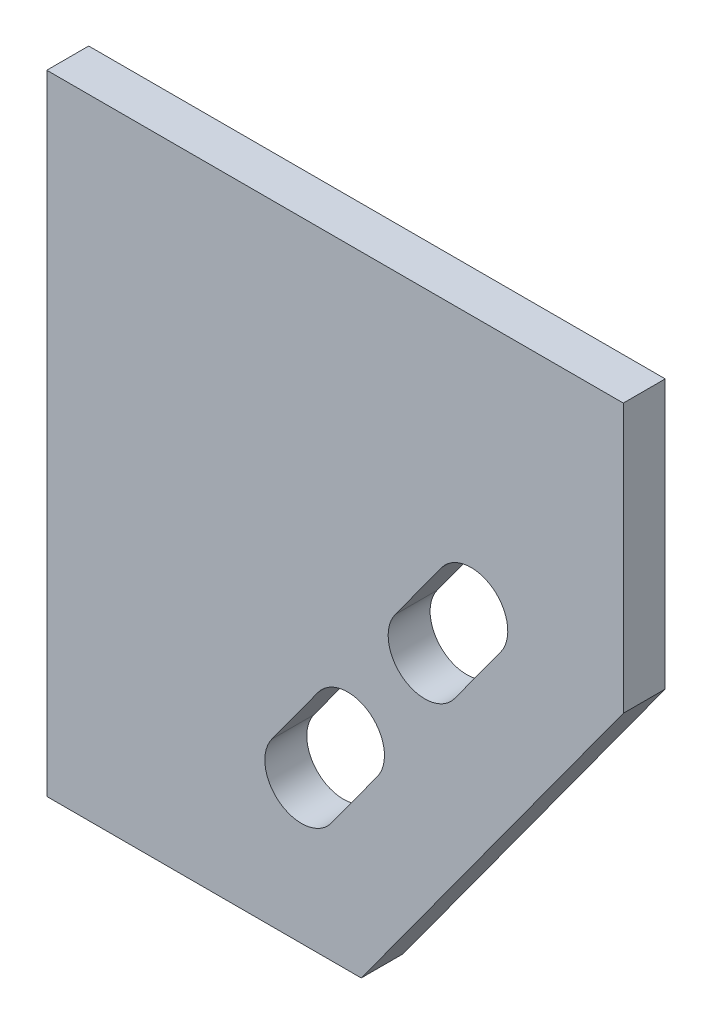
ISO-10303-21;
HEADER;
FILE_DESCRIPTION(('STEP AP214'),'2;1');
FILE_NAME('part.step','',(''),(''),'','','');
FILE_SCHEMA(('AUTOMOTIVE_DESIGN { 1 0 10303 214 1 1 1 1 }'));
ENDSEC;
DATA;
#1=APPLICATION_CONTEXT('core data for automotive mechanical design processes');
#2=APPLICATION_PROTOCOL_DEFINITION('international standard','automotive_design',2000,#1);
#3=PRODUCT_CONTEXT('',#1,'mechanical');
#4=PRODUCT('Part','Part','',(#3));
#5=PRODUCT_RELATED_PRODUCT_CATEGORY('part','',(#4));
#6=PRODUCT_DEFINITION_FORMATION('','',#4);
#7=PRODUCT_DEFINITION_CONTEXT('part definition',#1,'design');
#8=PRODUCT_DEFINITION('design','',#6,#7);
#9=PRODUCT_DEFINITION_SHAPE('','',#8);
#10=(LENGTH_UNIT() NAMED_UNIT(*) SI_UNIT(.MILLI.,.METRE.));
#11=(NAMED_UNIT(*) PLANE_ANGLE_UNIT() SI_UNIT($,.RADIAN.));
#12=(NAMED_UNIT(*) SI_UNIT($,.STERADIAN.) SOLID_ANGLE_UNIT());
#13=UNCERTAINTY_MEASURE_WITH_UNIT(LENGTH_MEASURE(1.E-05),#10,'distance_accuracy_value','');
#14=(GEOMETRIC_REPRESENTATION_CONTEXT(3) GLOBAL_UNCERTAINTY_ASSIGNED_CONTEXT((#13)) GLOBAL_UNIT_ASSIGNED_CONTEXT((#10,
#11,#12)) REPRESENTATION_CONTEXT('',''));
#15=CARTESIAN_POINT('',(0.,0.,0.));
#16=DIRECTION('',(0.,0.,1.));
#17=DIRECTION('',(1.,0.,0.));
#18=AXIS2_PLACEMENT_3D('',#15,#16,#17);
#19=CARTESIAN_POINT('',(59.9999999999996,0.,-8.00000000000001));
#20=DIRECTION('',(0.,-1.,0.));
#21=DIRECTION('',(1.,0.,0.));
#22=AXIS2_PLACEMENT_3D('',#19,#20,#21);
#23=PLANE('',#22);
#24=DIRECTION('',(1.,0.,0.));
#25=VECTOR('',#24,1.);
#26=CARTESIAN_POINT('',(59.9999999999996,0.,0.));
#27=LINE('',#26,#25);
#28=CARTESIAN_POINT('',(0.,0.,0.));
#29=VERTEX_POINT('',#28);
#30=CARTESIAN_POINT('',(59.9999999999996,0.,0.));
#31=VERTEX_POINT('',#30);
#32=EDGE_CURVE('E197',#29,#31,#27,.T.);
#33=ORIENTED_EDGE('',*,*,#32,.F.);
#34=DIRECTION('',(0.,0.,1.));
#35=VECTOR('',#34,1.);
#36=CARTESIAN_POINT('',(0.,0.,-8.00000000000001));
#37=LINE('',#36,#35);
#38=CARTESIAN_POINT('',(0.,0.,-8.00000000000001));
#39=VERTEX_POINT('',#38);
#40=EDGE_CURVE('E11',#39,#29,#37,.T.);
#41=ORIENTED_EDGE('',*,*,#40,.F.);
#42=DIRECTION('',(1.,0.,0.));
#43=VECTOR('',#42,1.);
#44=CARTESIAN_POINT('',(59.9999999999996,0.,-8.00000000000001));
#45=LINE('',#44,#43);
#46=CARTESIAN_POINT('',(59.9999999999996,0.,-8.00000000000001));
#47=VERTEX_POINT('',#46);
#48=EDGE_CURVE('E198',#39,#47,#45,.T.);
#49=ORIENTED_EDGE('',*,*,#48,.T.);
#50=DIRECTION('',(0.,0.,1.));
#51=VECTOR('',#50,1.);
#52=CARTESIAN_POINT('',(59.9999999999996,0.,-8.00000000000001));
#53=LINE('',#52,#51);
#54=EDGE_CURVE('E41',#47,#31,#53,.T.);
#55=ORIENTED_EDGE('',*,*,#54,.T.);
#56=EDGE_LOOP('',(#33,#41,#49,#55));
#57=FACE_BOUND('',#56,.T.);
#58=ADVANCED_FACE('F38',(#57),#23,.T.);
#59=CARTESIAN_POINT('',(0.,0.,-8.00000000000001));
#60=DIRECTION('',(-1.,0.,0.));
#61=DIRECTION('',(0.,0.,1.));
#62=AXIS2_PLACEMENT_3D('',#59,#60,#61);
#63=PLANE('',#62);
#64=DIRECTION('',(0.,-1.,0.));
#65=VECTOR('',#64,1.);
#66=CARTESIAN_POINT('',(0.,0.,0.));
#67=LINE('',#66,#65);
#68=CARTESIAN_POINT('',(0.,120.,-4.44089209850063E-13));
#69=VERTEX_POINT('',#68);
#70=EDGE_CURVE('E202',#69,#29,#67,.T.);
#71=ORIENTED_EDGE('',*,*,#70,.F.);
#72=DIRECTION('',(0.,0.,1.));
#73=VECTOR('',#72,1.);
#74=CARTESIAN_POINT('',(0.,120.,-8.00000000000045));
#75=LINE('',#74,#73);
#76=CARTESIAN_POINT('',(0.,120.,-8.00000000000045));
#77=VERTEX_POINT('',#76);
#78=EDGE_CURVE('E46',#77,#69,#75,.T.);
#79=ORIENTED_EDGE('',*,*,#78,.F.);
#80=DIRECTION('',(0.,-1.,0.));
#81=VECTOR('',#80,1.);
#82=CARTESIAN_POINT('',(0.,0.,-8.00000000000001));
#83=LINE('',#82,#81);
#84=EDGE_CURVE('E211',#77,#39,#83,.T.);
#85=ORIENTED_EDGE('',*,*,#84,.T.);
#86=ORIENTED_EDGE('',*,*,#40,.T.);
#87=EDGE_LOOP('',(#71,#79,#85,#86));
#88=FACE_BOUND('',#87,.T.);
#89=ADVANCED_FACE('F242',(#88),#63,.T.);
#90=CARTESIAN_POINT('',(0.,120.,-8.00000000000045));
#91=DIRECTION('',(0.,1.,0.));
#92=DIRECTION('',(0.,0.,1.));
#93=AXIS2_PLACEMENT_3D('',#90,#91,#92);
#94=PLANE('',#93);
#95=DIRECTION('',(-1.,0.,0.));
#96=VECTOR('',#95,1.);
#97=CARTESIAN_POINT('',(0.,120.,-4.44089209850063E-13));
#98=LINE('',#97,#96);
#99=CARTESIAN_POINT('',(110.,120.,-4.44089209850063E-13));
#100=VERTEX_POINT('',#99);
#101=EDGE_CURVE('E222',#100,#69,#98,.T.);
#102=ORIENTED_EDGE('',*,*,#101,.F.);
#103=DIRECTION('',(0.,0.,1.));
#104=VECTOR('',#103,1.);
#105=CARTESIAN_POINT('',(110.,120.,-8.00000000000045));
#106=LINE('',#105,#104);
#107=CARTESIAN_POINT('',(110.,120.,-8.00000000000045));
#108=VERTEX_POINT('',#107);
#109=EDGE_CURVE('E228',#108,#100,#106,.T.);
#110=ORIENTED_EDGE('',*,*,#109,.F.);
#111=DIRECTION('',(-1.,0.,0.));
#112=VECTOR('',#111,1.);
#113=CARTESIAN_POINT('',(0.,120.,-8.00000000000045));
#114=LINE('',#113,#112);
#115=EDGE_CURVE('E208',#108,#77,#114,.T.);
#116=ORIENTED_EDGE('',*,*,#115,.T.);
#117=ORIENTED_EDGE('',*,*,#78,.T.);
#118=EDGE_LOOP('',(#102,#110,#116,#117));
#119=FACE_BOUND('',#118,.T.);
#120=ADVANCED_FACE('F251',(#119),#94,.T.);
#121=CARTESIAN_POINT('',(110.,120.,-8.00000000000045));
#122=DIRECTION('',(1.,0.,0.));
#123=DIRECTION('',(0.,1.,0.));
#124=AXIS2_PLACEMENT_3D('',#121,#122,#123);
#125=PLANE('',#124);
#126=DIRECTION('',(0.,1.,0.));
#127=VECTOR('',#126,1.);
#128=CARTESIAN_POINT('',(110.,120.,-4.44089209850063E-13));
#129=LINE('',#128,#127);
#130=CARTESIAN_POINT('',(110.,68.7386354243378,-4.44089209850063E-13));
#131=VERTEX_POINT('',#130);
#132=EDGE_CURVE('E219',#131,#100,#129,.T.);
#133=ORIENTED_EDGE('',*,*,#132,.F.);
#134=DIRECTION('',(0.,0.,1.));
#135=VECTOR('',#134,1.);
#136=CARTESIAN_POINT('',(110.,68.7386354243378,-8.00000000000045));
#137=LINE('',#136,#135);
#138=CARTESIAN_POINT('',(110.,68.7386354243378,-8.00000000000045));
#139=VERTEX_POINT('',#138);
#140=EDGE_CURVE('E229',#139,#131,#137,.T.);
#141=ORIENTED_EDGE('',*,*,#140,.F.);
#142=DIRECTION('',(0.,1.,0.));
#143=VECTOR('',#142,1.);
#144=CARTESIAN_POINT('',(110.,120.,-8.00000000000045));
#145=LINE('',#144,#143);
#146=EDGE_CURVE('E205',#139,#108,#145,.T.);
#147=ORIENTED_EDGE('',*,*,#146,.T.);
#148=ORIENTED_EDGE('',*,*,#109,.T.);
#149=EDGE_LOOP('',(#133,#141,#147,#148));
#150=FACE_BOUND('',#149,.T.);
#151=ADVANCED_FACE('F249',(#150),#125,.T.);
#152=CARTESIAN_POINT('',(110.,68.7386354243378,-8.00000000000045));
#153=DIRECTION('',(0.808689828521619,-0.588235294117647,0.));
#154=DIRECTION('',(0.588235294117647,0.808689828521619,0.));
#155=AXIS2_PLACEMENT_3D('',#152,#153,#154);
#156=PLANE('',#155);
#157=DIRECTION('',(0.588235294117647,0.808689828521619,0.));
#158=VECTOR('',#157,1.);
#159=CARTESIAN_POINT('',(110.,68.7386354243378,-4.44089209850063E-13));
#160=LINE('',#159,#158);
#161=EDGE_CURVE('E216',#31,#131,#160,.T.);
#162=ORIENTED_EDGE('',*,*,#161,.F.);
#163=ORIENTED_EDGE('',*,*,#54,.F.);
#164=DIRECTION('',(0.588235294117647,0.808689828521619,0.));
#165=VECTOR('',#164,1.);
#166=CARTESIAN_POINT('',(110.,68.7386354243378,-8.00000000000045));
#167=LINE('',#166,#165);
#168=EDGE_CURVE('E201',#47,#139,#167,.T.);
#169=ORIENTED_EDGE('',*,*,#168,.T.);
#170=ORIENTED_EDGE('',*,*,#140,.T.);
#171=EDGE_LOOP('',(#162,#163,#169,#170));
#172=FACE_BOUND('',#171,.T.);
#173=ADVANCED_FACE('F237',(#172),#156,.T.);
#174=CARTESIAN_POINT('',(0.,0.,-8.00000000000001));
#175=DIRECTION('',(0.,0.,-1.));
#176=DIRECTION('',(-1.,0.,0.));
#177=AXIS2_PLACEMENT_3D('',#174,#175,#176);
#178=PLANE('',#177);
#179=CARTESIAN_POINT('',(72.1356954634302,59.1838229216304,-8.00000000000045));
#180=DIRECTION('',(0.,0.,-1.));
#181=DIRECTION('',(-1.,0.,0.));
#182=AXIS2_PLACEMENT_3D('',#179,#180,#181);
#183=CIRCLE('',#182,6.99999999999999);
#184=CARTESIAN_POINT('',(77.7965242630812,55.0661758628066,-8.00000000000045));
#185=VERTEX_POINT('',#184);
#186=CARTESIAN_POINT('',(66.4748666637784,63.3014699804537,-8.00000000000045));
#187=VERTEX_POINT('',#186);
#188=EDGE_CURVE('E195',#185,#187,#183,.T.);
#189=ORIENTED_EDGE('',*,*,#188,.F.);
#190=DIRECTION('',(-0.588235294117648,-0.808689828521619,0.));
#191=VECTOR('',#190,1.);
#192=CARTESIAN_POINT('',(24.6823374118703,-17.9537586537042,-8.00000000000001));
#193=LINE('',#192,#191);
#194=CARTESIAN_POINT('',(86.6200536748458,67.1965232906309,-8.00000000000045));
#195=VERTEX_POINT('',#194);
#196=EDGE_CURVE('E190',#195,#185,#193,.T.);
#197=ORIENTED_EDGE('',*,*,#196,.F.);
#198=CARTESIAN_POINT('',(80.9592248751949,71.3141703494546,-8.00000000000045));
#199=DIRECTION('',(0.,0.,-1.));
#200=DIRECTION('',(-1.,0.,0.));
#201=AXIS2_PLACEMENT_3D('',#198,#199,#200);
#202=CIRCLE('',#201,6.99999999999999);
#203=CARTESIAN_POINT('',(75.2983960755431,75.431817408278,-8.00000000000045));
#204=VERTEX_POINT('',#203);
#205=EDGE_CURVE('E138',#204,#195,#202,.T.);
#206=ORIENTED_EDGE('',*,*,#205,.F.);
#207=DIRECTION('',(0.588235294117648,0.808689828521618,0.));
#208=VECTOR('',#207,1.);
#209=CARTESIAN_POINT('',(13.3606798125676,-9.71846453605707,-8.00000000000001));
#210=LINE('',#209,#208);
#211=EDGE_CURVE('E193',#187,#204,#210,.T.);
#212=ORIENTED_EDGE('',*,*,#211,.F.);
#213=EDGE_LOOP('',(#189,#197,#206,#212));
#214=FACE_BOUND('',#213,.T.);
#215=CARTESIAN_POINT('',(57.4298131104891,38.9665772085896,-8.00000000000045));
#216=DIRECTION('',(0.,0.,-1.));
#217=DIRECTION('',(-1.,0.,0.));
#218=AXIS2_PLACEMENT_3D('',#215,#216,#217);
#219=CIRCLE('',#218,6.99999999999999);
#220=CARTESIAN_POINT('',(51.7689843108373,43.0842242674134,-8.00000000000045));
#221=VERTEX_POINT('',#220);
#222=CARTESIAN_POINT('',(63.09064191014,34.8489301497663,-8.00000000000045));
#223=VERTEX_POINT('',#222);
#224=EDGE_CURVE('E188',#221,#223,#219,.T.);
#225=ORIENTED_EDGE('',*,*,#224,.F.);
#226=DIRECTION('',(0.588235294117647,0.808689828521619,0.));
#227=VECTOR('',#226,1.);
#228=CARTESIAN_POINT('',(13.3606798125676,-9.71846453605707,-8.00000000000001));
#229=LINE('',#228,#227);
#230=CARTESIAN_POINT('',(42.9454548990726,30.9538768395892,-8.00000000000045));
#231=VERTEX_POINT('',#230);
#232=EDGE_CURVE('E162',#231,#221,#229,.T.);
#233=ORIENTED_EDGE('',*,*,#232,.F.);
#234=CARTESIAN_POINT('',(48.6062836987244,26.8362297807654,-8.00000000000045));
#235=DIRECTION('',(0.,0.,-1.));
#236=DIRECTION('',(-1.,0.,0.));
#237=AXIS2_PLACEMENT_3D('',#234,#235,#236);
#238=CIRCLE('',#237,7.);
#239=CARTESIAN_POINT('',(54.2671124983753,22.718582721942,-8.00000000000001));
#240=VERTEX_POINT('',#239);
#241=EDGE_CURVE('E184',#240,#231,#238,.T.);
#242=ORIENTED_EDGE('',*,*,#241,.F.);
#243=DIRECTION('',(-0.588235294117647,-0.808689828521619,0.));
#244=VECTOR('',#243,1.);
#245=CARTESIAN_POINT('',(24.6823374118703,-17.9537586537042,-8.00000000000001));
#246=LINE('',#245,#244);
#247=EDGE_CURVE('E186',#223,#240,#246,.T.);
#248=ORIENTED_EDGE('',*,*,#247,.F.);
#249=EDGE_LOOP('',(#225,#233,#242,#248));
#250=FACE_BOUND('',#249,.T.);
#251=ORIENTED_EDGE('',*,*,#48,.F.);
#252=ORIENTED_EDGE('',*,*,#84,.F.);
#253=ORIENTED_EDGE('',*,*,#115,.F.);
#254=ORIENTED_EDGE('',*,*,#146,.F.);
#255=ORIENTED_EDGE('',*,*,#168,.F.);
#256=EDGE_LOOP('',(#251,#252,#253,#254,#255));
#257=FACE_BOUND('',#256,.T.);
#258=ADVANCED_FACE('F245',(#214,#250,#257),#178,.T.);
#259=CARTESIAN_POINT('',(0.,0.,0.));
#260=DIRECTION('',(0.,0.,-1.));
#261=DIRECTION('',(-1.,0.,0.));
#262=AXIS2_PLACEMENT_3D('',#259,#260,#261);
#263=PLANE('',#262);
#264=DIRECTION('',(0.588235294117648,0.808689828521618,0.));
#265=VECTOR('',#264,1.);
#266=CARTESIAN_POINT('',(77.7965242630812,55.0661758628066,-4.44089209850063E-13));
#267=LINE('',#266,#265);
#268=CARTESIAN_POINT('',(77.7965242630812,55.0661758628066,-4.44089209850063E-13));
#269=VERTEX_POINT('',#268);
#270=CARTESIAN_POINT('',(86.6200536748458,67.1965232906309,-4.44089209850063E-13));
#271=VERTEX_POINT('',#270);
#272=EDGE_CURVE('E145',#269,#271,#267,.T.);
#273=ORIENTED_EDGE('',*,*,#272,.F.);
#274=CARTESIAN_POINT('',(72.1356954634302,59.1838229216304,-4.44089209850063E-13));
#275=DIRECTION('',(0.,0.,1.));
#276=DIRECTION('',(1.,0.,0.));
#277=AXIS2_PLACEMENT_3D('',#274,#275,#276);
#278=CIRCLE('',#277,6.99999999999999);
#279=CARTESIAN_POINT('',(66.4748666637784,63.3014699804537,-4.44089209850063E-13));
#280=VERTEX_POINT('',#279);
#281=EDGE_CURVE('E150',#280,#269,#278,.T.);
#282=ORIENTED_EDGE('',*,*,#281,.F.);
#283=DIRECTION('',(-0.588235294117648,-0.808689828521618,0.));
#284=VECTOR('',#283,1.);
#285=CARTESIAN_POINT('',(66.4748666637784,63.3014699804537,-4.44089209850063E-13));
#286=LINE('',#285,#284);
#287=CARTESIAN_POINT('',(75.2983960755431,75.431817408278,-4.44089209850063E-13));
#288=VERTEX_POINT('',#287);
#289=EDGE_CURVE('E155',#288,#280,#286,.T.);
#290=ORIENTED_EDGE('',*,*,#289,.F.);
#291=CARTESIAN_POINT('',(80.9592248751949,71.3141703494546,-4.44089209850063E-13));
#292=DIRECTION('',(0.,0.,1.));
#293=DIRECTION('',(1.,0.,0.));
#294=AXIS2_PLACEMENT_3D('',#291,#292,#293);
#295=CIRCLE('',#294,6.99999999999999);
#296=EDGE_CURVE('E135',#271,#288,#295,.T.);
#297=ORIENTED_EDGE('',*,*,#296,.F.);
#298=EDGE_LOOP('',(#273,#282,#290,#297));
#299=FACE_BOUND('',#298,.T.);
#300=DIRECTION('',(-0.588235294117647,-0.808689828521619,0.));
#301=VECTOR('',#300,1.);
#302=CARTESIAN_POINT('',(51.7689843108373,43.0842242674134,-4.44089209850063E-13));
#303=LINE('',#302,#301);
#304=CARTESIAN_POINT('',(51.7689843108373,43.0842242674134,-4.44089209850063E-13));
#305=VERTEX_POINT('',#304);
#306=CARTESIAN_POINT('',(42.9454548990726,30.9538768395892,-4.44089209850063E-13));
#307=VERTEX_POINT('',#306);
#308=EDGE_CURVE('E167',#305,#307,#303,.T.);
#309=ORIENTED_EDGE('',*,*,#308,.F.);
#310=CARTESIAN_POINT('',(57.4298131104891,38.9665772085896,-4.44089209850063E-13));
#311=DIRECTION('',(0.,0.,1.));
#312=DIRECTION('',(-1.,0.,0.));
#313=AXIS2_PLACEMENT_3D('',#310,#311,#312);
#314=CIRCLE('',#313,6.99999999999999);
#315=CARTESIAN_POINT('',(63.09064191014,34.8489301497663,-4.44089209850063E-13));
#316=VERTEX_POINT('',#315);
#317=EDGE_CURVE('E165',#316,#305,#314,.T.);
#318=ORIENTED_EDGE('',*,*,#317,.F.);
#319=DIRECTION('',(0.588235294117647,0.808689828521619,0.));
#320=VECTOR('',#319,1.);
#321=CARTESIAN_POINT('',(63.09064191014,34.8489301497663,-4.44089209850063E-13));
#322=LINE('',#321,#320);
#323=CARTESIAN_POINT('',(54.2671124983753,22.718582721942,0.));
#324=VERTEX_POINT('',#323);
#325=EDGE_CURVE('E172',#324,#316,#322,.T.);
#326=ORIENTED_EDGE('',*,*,#325,.F.);
#327=CARTESIAN_POINT('',(48.6062836987244,26.8362297807654,-4.44089209850063E-13));
#328=DIRECTION('',(0.,0.,1.));
#329=DIRECTION('',(-1.,0.,0.));
#330=AXIS2_PLACEMENT_3D('',#327,#328,#329);
#331=CIRCLE('',#330,7.);
#332=EDGE_CURVE('E169',#307,#324,#331,.T.);
#333=ORIENTED_EDGE('',*,*,#332,.F.);
#334=EDGE_LOOP('',(#309,#318,#326,#333));
#335=FACE_BOUND('',#334,.T.);
#336=ORIENTED_EDGE('',*,*,#32,.T.);
#337=ORIENTED_EDGE('',*,*,#161,.T.);
#338=ORIENTED_EDGE('',*,*,#132,.T.);
#339=ORIENTED_EDGE('',*,*,#101,.T.);
#340=ORIENTED_EDGE('',*,*,#70,.T.);
#341=EDGE_LOOP('',(#336,#337,#338,#339,#340));
#342=FACE_BOUND('',#341,.T.);
#343=ADVANCED_FACE('F152',(#299,#335,#342),#263,.F.);
#344=CARTESIAN_POINT('',(57.4298131104891,38.9665772085896,-10.0000000000005));
#345=DIRECTION('',(0.,0.,1.));
#346=DIRECTION('',(1.,0.,0.));
#347=AXIS2_PLACEMENT_3D('',#344,#345,#346);
#348=CYLINDRICAL_SURFACE('',#347,6.99999999999999);
#349=ORIENTED_EDGE('',*,*,#224,.T.);
#350=DIRECTION('',(0.,0.,1.));
#351=VECTOR('',#350,1.);
#352=CARTESIAN_POINT('',(63.09064191014,34.8489301497663,-10.0000000000005));
#353=LINE('',#352,#351);
#354=EDGE_CURVE('E176',#223,#316,#353,.T.);
#355=ORIENTED_EDGE('',*,*,#354,.T.);
#356=ORIENTED_EDGE('',*,*,#317,.T.);
#357=DIRECTION('',(0.,0.,1.));
#358=VECTOR('',#357,1.);
#359=CARTESIAN_POINT('',(51.7689843108373,43.0842242674134,-10.0000000000005));
#360=LINE('',#359,#358);
#361=EDGE_CURVE('E175',#221,#305,#360,.T.);
#362=ORIENTED_EDGE('',*,*,#361,.F.);
#363=EDGE_LOOP('',(#349,#355,#356,#362));
#364=FACE_BOUND('',#363,.T.);
#365=ADVANCED_FACE('F307',(#364),#348,.F.);
#366=CARTESIAN_POINT('',(63.09064191014,34.8489301497663,-10.0000000000005));
#367=DIRECTION('',(0.808689828521619,-0.588235294117647,0.));
#368=DIRECTION('',(0.588235294117647,0.808689828521619,0.));
#369=AXIS2_PLACEMENT_3D('',#366,#367,#368);
#370=PLANE('',#369);
#371=ORIENTED_EDGE('',*,*,#247,.T.);
#372=DIRECTION('',(0.,0.,1.));
#373=VECTOR('',#372,1.);
#374=CARTESIAN_POINT('',(54.2671124983753,22.718582721942,-10.));
#375=LINE('',#374,#373);
#376=EDGE_CURVE('E178',#240,#324,#375,.T.);
#377=ORIENTED_EDGE('',*,*,#376,.T.);
#378=ORIENTED_EDGE('',*,*,#325,.T.);
#379=ORIENTED_EDGE('',*,*,#354,.F.);
#380=EDGE_LOOP('',(#371,#377,#378,#379));
#381=FACE_BOUND('',#380,.T.);
#382=ADVANCED_FACE('F317',(#381),#370,.F.);
#383=CARTESIAN_POINT('',(48.6062836987244,26.8362297807654,-10.0000000000005));
#384=DIRECTION('',(0.,0.,1.));
#385=DIRECTION('',(1.,0.,0.));
#386=AXIS2_PLACEMENT_3D('',#383,#384,#385);
#387=CYLINDRICAL_SURFACE('',#386,7.);
#388=ORIENTED_EDGE('',*,*,#241,.T.);
#389=DIRECTION('',(0.,0.,1.));
#390=VECTOR('',#389,1.);
#391=CARTESIAN_POINT('',(42.9454548990726,30.9538768395892,-10.0000000000005));
#392=LINE('',#391,#390);
#393=EDGE_CURVE('E62',#231,#307,#392,.T.);
#394=ORIENTED_EDGE('',*,*,#393,.T.);
#395=ORIENTED_EDGE('',*,*,#332,.T.);
#396=ORIENTED_EDGE('',*,*,#376,.F.);
#397=EDGE_LOOP('',(#388,#394,#395,#396));
#398=FACE_BOUND('',#397,.T.);
#399=ADVANCED_FACE('F328',(#398),#387,.F.);
#400=CARTESIAN_POINT('',(51.7689843108373,43.0842242674134,-10.0000000000005));
#401=DIRECTION('',(-0.808689828521619,0.588235294117647,0.));
#402=DIRECTION('',(-0.588235294117647,-0.808689828521619,0.));
#403=AXIS2_PLACEMENT_3D('',#400,#401,#402);
#404=PLANE('',#403);
#405=ORIENTED_EDGE('',*,*,#232,.T.);
#406=ORIENTED_EDGE('',*,*,#361,.T.);
#407=ORIENTED_EDGE('',*,*,#308,.T.);
#408=ORIENTED_EDGE('',*,*,#393,.F.);
#409=EDGE_LOOP('',(#405,#406,#407,#408));
#410=FACE_BOUND('',#409,.T.);
#411=ADVANCED_FACE('F339',(#410),#404,.F.);
#412=CARTESIAN_POINT('',(72.1356954634302,59.1838229216304,-10.0000000000005));
#413=DIRECTION('',(0.,0.,1.));
#414=DIRECTION('',(1.,0.,0.));
#415=AXIS2_PLACEMENT_3D('',#412,#413,#414);
#416=CYLINDRICAL_SURFACE('',#415,6.99999999999999);
#417=ORIENTED_EDGE('',*,*,#188,.T.);
#418=DIRECTION('',(0.,0.,1.));
#419=VECTOR('',#418,1.);
#420=CARTESIAN_POINT('',(66.4748666637784,63.3014699804537,-10.0000000000005));
#421=LINE('',#420,#419);
#422=EDGE_CURVE('E160',#187,#280,#421,.T.);
#423=ORIENTED_EDGE('',*,*,#422,.T.);
#424=ORIENTED_EDGE('',*,*,#281,.T.);
#425=DIRECTION('',(0.,0.,1.));
#426=VECTOR('',#425,1.);
#427=CARTESIAN_POINT('',(77.7965242630812,55.0661758628066,-10.0000000000005));
#428=LINE('',#427,#426);
#429=EDGE_CURVE('E141',#185,#269,#428,.T.);
#430=ORIENTED_EDGE('',*,*,#429,.F.);
#431=EDGE_LOOP('',(#417,#423,#424,#430));
#432=FACE_BOUND('',#431,.T.);
#433=ADVANCED_FACE('F350',(#432),#416,.F.);
#434=CARTESIAN_POINT('',(66.4748666637784,63.3014699804537,-10.0000000000005));
#435=DIRECTION('',(-0.808689828521618,0.588235294117648,0.));
#436=DIRECTION('',(-0.588235294117648,-0.808689828521618,0.));
#437=AXIS2_PLACEMENT_3D('',#434,#435,#436);
#438=PLANE('',#437);
#439=ORIENTED_EDGE('',*,*,#211,.T.);
#440=DIRECTION('',(0.,0.,1.));
#441=VECTOR('',#440,1.);
#442=CARTESIAN_POINT('',(75.2983960755431,75.431817408278,-10.0000000000005));
#443=LINE('',#442,#441);
#444=EDGE_CURVE('E140',#204,#288,#443,.T.);
#445=ORIENTED_EDGE('',*,*,#444,.T.);
#446=ORIENTED_EDGE('',*,*,#289,.T.);
#447=ORIENTED_EDGE('',*,*,#422,.F.);
#448=EDGE_LOOP('',(#439,#445,#446,#447));
#449=FACE_BOUND('',#448,.T.);
#450=ADVANCED_FACE('F360',(#449),#438,.F.);
#451=CARTESIAN_POINT('',(80.9592248751949,71.3141703494546,-10.0000000000005));
#452=DIRECTION('',(0.,0.,1.));
#453=DIRECTION('',(1.,0.,0.));
#454=AXIS2_PLACEMENT_3D('',#451,#452,#453);
#455=CYLINDRICAL_SURFACE('',#454,6.99999999999999);
#456=ORIENTED_EDGE('',*,*,#205,.T.);
#457=DIRECTION('',(0.,0.,1.));
#458=VECTOR('',#457,1.);
#459=CARTESIAN_POINT('',(86.6200536748458,67.1965232906309,-10.0000000000005));
#460=LINE('',#459,#458);
#461=EDGE_CURVE('E54',#195,#271,#460,.T.);
#462=ORIENTED_EDGE('',*,*,#461,.T.);
#463=ORIENTED_EDGE('',*,*,#296,.T.);
#464=ORIENTED_EDGE('',*,*,#444,.F.);
#465=EDGE_LOOP('',(#456,#462,#463,#464));
#466=FACE_BOUND('',#465,.T.);
#467=ADVANCED_FACE('F132',(#466),#455,.F.);
#468=CARTESIAN_POINT('',(77.7965242630812,55.0661758628066,-10.0000000000005));
#469=DIRECTION('',(0.808689828521618,-0.588235294117648,0.));
#470=DIRECTION('',(0.588235294117648,0.808689828521619,0.));
#471=AXIS2_PLACEMENT_3D('',#468,#469,#470);
#472=PLANE('',#471);
#473=ORIENTED_EDGE('',*,*,#196,.T.);
#474=ORIENTED_EDGE('',*,*,#429,.T.);
#475=ORIENTED_EDGE('',*,*,#272,.T.);
#476=ORIENTED_EDGE('',*,*,#461,.F.);
#477=EDGE_LOOP('',(#473,#474,#475,#476));
#478=FACE_BOUND('',#477,.T.);
#479=ADVANCED_FACE('F146',(#478),#472,.F.);
#480=CLOSED_SHELL('',(#58,#89,#120,#151,#173,#258,#343,#365,#382,#399,#411,#433,#450,#467,#479));
#481=MANIFOLD_SOLID_BREP('B2',#480);
#482=ADVANCED_BREP_SHAPE_REPRESENTATION('',(#18,#481),#14);
#483=SHAPE_DEFINITION_REPRESENTATION(#9,#482);
ENDSEC;
END-ISO-10303-21;
